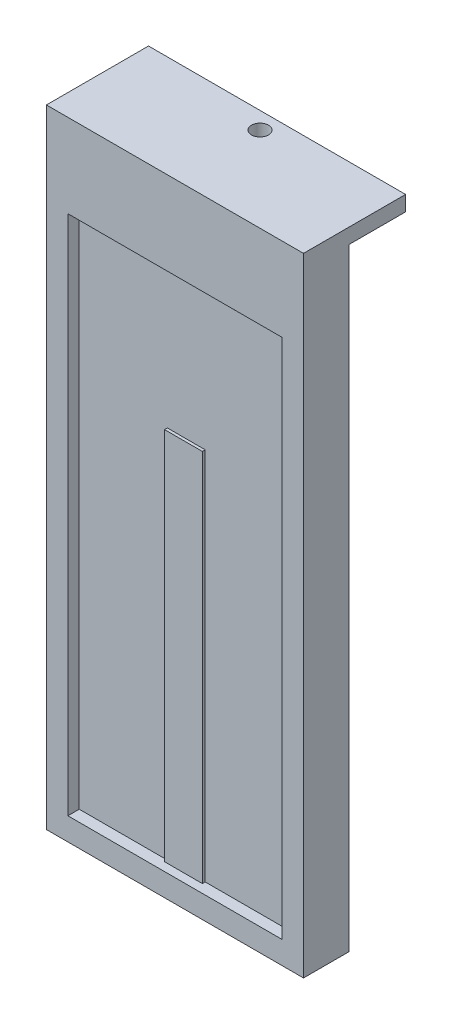
ISO-10303-21;
HEADER;
FILE_DESCRIPTION(('STEP AP214'),'2;1');
FILE_NAME('part.step','',(''),(''),'','','');
FILE_SCHEMA(('AUTOMOTIVE_DESIGN { 1 0 10303 214 1 1 1 1 }'));
ENDSEC;
DATA;
#1=APPLICATION_CONTEXT('core data for automotive mechanical design processes');
#2=APPLICATION_PROTOCOL_DEFINITION('international standard','automotive_design',2000,#1);
#3=PRODUCT_CONTEXT('',#1,'mechanical');
#4=PRODUCT('Part','Part','',(#3));
#5=PRODUCT_RELATED_PRODUCT_CATEGORY('part','',(#4));
#6=PRODUCT_DEFINITION_FORMATION('','',#4);
#7=PRODUCT_DEFINITION_CONTEXT('part definition',#1,'design');
#8=PRODUCT_DEFINITION('design','',#6,#7);
#9=PRODUCT_DEFINITION_SHAPE('','',#8);
#10=(LENGTH_UNIT() NAMED_UNIT(*) SI_UNIT(.MILLI.,.METRE.));
#11=(NAMED_UNIT(*) PLANE_ANGLE_UNIT() SI_UNIT($,.RADIAN.));
#12=(NAMED_UNIT(*) SI_UNIT($,.STERADIAN.) SOLID_ANGLE_UNIT());
#13=UNCERTAINTY_MEASURE_WITH_UNIT(LENGTH_MEASURE(1.E-05),#10,'distance_accuracy_value','');
#14=(GEOMETRIC_REPRESENTATION_CONTEXT(3) GLOBAL_UNCERTAINTY_ASSIGNED_CONTEXT((#13)) GLOBAL_UNIT_ASSIGNED_CONTEXT((#10,
#11,#12)) REPRESENTATION_CONTEXT('',''));
#15=CARTESIAN_POINT('',(0.,0.,0.));
#16=DIRECTION('',(0.,0.,1.));
#17=DIRECTION('',(1.,0.,0.));
#18=AXIS2_PLACEMENT_3D('',#15,#16,#17);
#19=CARTESIAN_POINT('',(-28.321,-75.,9.));
#20=DIRECTION('',(0.,-1.,0.));
#21=DIRECTION('',(0.,0.,-1.));
#22=AXIS2_PLACEMENT_3D('',#19,#20,#21);
#23=PLANE('',#22);
#24=DIRECTION('',(0.,0.,-1.));
#25=VECTOR('',#24,1.);
#26=CARTESIAN_POINT('',(5.,-75.,9.746));
#27=LINE('',#26,#25);
#28=CARTESIAN_POINT('',(5.,-75.,9.746));
#29=VERTEX_POINT('',#28);
#30=CARTESIAN_POINT('',(5.,-75.,9.));
#31=VERTEX_POINT('',#30);
#32=EDGE_CURVE('E65',#29,#31,#27,.T.);
#33=ORIENTED_EDGE('',*,*,#32,.F.);
#34=DIRECTION('',(1.,0.,0.));
#35=VECTOR('',#34,1.);
#36=CARTESIAN_POINT('',(-5.,-75.,9.746));
#37=LINE('',#36,#35);
#38=CARTESIAN_POINT('',(-5.,-75.,9.746));
#39=VERTEX_POINT('',#38);
#40=EDGE_CURVE('E60',#39,#29,#37,.T.);
#41=ORIENTED_EDGE('',*,*,#40,.F.);
#42=DIRECTION('',(0.,0.,-1.));
#43=VECTOR('',#42,1.);
#44=CARTESIAN_POINT('',(-5.,-75.,9.746));
#45=LINE('',#44,#43);
#46=CARTESIAN_POINT('',(-5.,-75.,9.));
#47=VERTEX_POINT('',#46);
#48=EDGE_CURVE('E176',#39,#47,#45,.T.);
#49=ORIENTED_EDGE('',*,*,#48,.T.);
#50=DIRECTION('',(1.,0.,0.));
#51=VECTOR('',#50,1.);
#52=CARTESIAN_POINT('',(-28.321,-75.,9.));
#53=LINE('',#52,#51);
#54=CARTESIAN_POINT('',(-28.321,-75.,9.));
#55=VERTEX_POINT('',#54);
#56=EDGE_CURVE('E194',#55,#47,#53,.T.);
#57=ORIENTED_EDGE('',*,*,#56,.F.);
#58=DIRECTION('',(0.,0.,1.));
#59=VECTOR('',#58,1.);
#60=CARTESIAN_POINT('',(-28.321,-75.,9.));
#61=LINE('',#60,#59);
#62=CARTESIAN_POINT('',(-28.321,-75.,12.));
#63=VERTEX_POINT('',#62);
#64=EDGE_CURVE('E212',#55,#63,#61,.T.);
#65=ORIENTED_EDGE('',*,*,#64,.T.);
#66=DIRECTION('',(1.,0.,0.));
#67=VECTOR('',#66,1.);
#68=CARTESIAN_POINT('',(-28.321,-75.,12.));
#69=LINE('',#68,#67);
#70=CARTESIAN_POINT('',(28.321,-75.,12.));
#71=VERTEX_POINT('',#70);
#72=EDGE_CURVE('E185',#63,#71,#69,.T.);
#73=ORIENTED_EDGE('',*,*,#72,.T.);
#74=DIRECTION('',(0.,0.,1.));
#75=VECTOR('',#74,1.);
#76=CARTESIAN_POINT('',(28.321,-75.,9.));
#77=LINE('',#76,#75);
#78=CARTESIAN_POINT('',(28.321,-75.,9.));
#79=VERTEX_POINT('',#78);
#80=EDGE_CURVE('E208',#79,#71,#77,.T.);
#81=ORIENTED_EDGE('',*,*,#80,.F.);
#82=EDGE_CURVE('E193',#31,#79,#53,.T.);
#83=ORIENTED_EDGE('',*,*,#82,.F.);
#84=EDGE_LOOP('',(#33,#41,#49,#57,#65,#73,#81,#83));
#85=FACE_BOUND('',#84,.T.);
#86=ADVANCED_FACE('F43',(#85),#23,.F.);
#87=CARTESIAN_POINT('',(0.,0.,9.));
#88=DIRECTION('',(0.,0.,-1.));
#89=DIRECTION('',(-1.,0.,0.));
#90=AXIS2_PLACEMENT_3D('',#87,#88,#89);
#91=PLANE('',#90);
#92=DIRECTION('',(0.,1.,0.));
#93=VECTOR('',#92,1.);
#94=CARTESIAN_POINT('',(5.,24.,9.));
#95=LINE('',#94,#93);
#96=CARTESIAN_POINT('',(5.,24.,9.));
#97=VERTEX_POINT('',#96);
#98=EDGE_CURVE('E168',#31,#97,#95,.T.);
#99=ORIENTED_EDGE('',*,*,#98,.F.);
#100=ORIENTED_EDGE('',*,*,#82,.T.);
#101=DIRECTION('',(0.,1.,0.));
#102=VECTOR('',#101,1.);
#103=CARTESIAN_POINT('',(28.321,-75.,9.));
#104=LINE('',#103,#102);
#105=CARTESIAN_POINT('',(28.321,62.922,9.));
#106=VERTEX_POINT('',#105);
#107=EDGE_CURVE('E180',#79,#106,#104,.T.);
#108=ORIENTED_EDGE('',*,*,#107,.T.);
#109=DIRECTION('',(-1.,0.,0.));
#110=VECTOR('',#109,1.);
#111=CARTESIAN_POINT('',(-28.321,62.922,9.));
#112=LINE('',#111,#110);
#113=CARTESIAN_POINT('',(-28.321,62.922,9.));
#114=VERTEX_POINT('',#113);
#115=EDGE_CURVE('E184',#106,#114,#112,.T.);
#116=ORIENTED_EDGE('',*,*,#115,.T.);
#117=DIRECTION('',(0.,-1.,0.));
#118=VECTOR('',#117,1.);
#119=CARTESIAN_POINT('',(-28.321,-75.,9.));
#120=LINE('',#119,#118);
#121=EDGE_CURVE('E189',#114,#55,#120,.T.);
#122=ORIENTED_EDGE('',*,*,#121,.T.);
#123=ORIENTED_EDGE('',*,*,#56,.T.);
#124=DIRECTION('',(0.,-1.,0.));
#125=VECTOR('',#124,1.);
#126=CARTESIAN_POINT('',(-5.,24.,9.));
#127=LINE('',#126,#125);
#128=CARTESIAN_POINT('',(-5.,24.,9.));
#129=VERTEX_POINT('',#128);
#130=EDGE_CURVE('E165',#129,#47,#127,.T.);
#131=ORIENTED_EDGE('',*,*,#130,.F.);
#132=DIRECTION('',(-1.,0.,0.));
#133=VECTOR('',#132,1.);
#134=CARTESIAN_POINT('',(-5.,24.,9.));
#135=LINE('',#134,#133);
#136=EDGE_CURVE('E516',#97,#129,#135,.T.);
#137=ORIENTED_EDGE('',*,*,#136,.F.);
#138=EDGE_LOOP('',(#99,#100,#108,#116,#122,#123,#131,#137));
#139=FACE_BOUND('',#138,.T.);
#140=ADVANCED_FACE('F321',(#139),#91,.F.);
#141=CARTESIAN_POINT('',(34.,-81.,12.));
#142=DIRECTION('',(-1.,0.,0.));
#143=DIRECTION('',(0.,0.,1.));
#144=AXIS2_PLACEMENT_3D('',#141,#142,#143);
#145=PLANE('',#144);
#146=DIRECTION('',(0.,1.,0.));
#147=VECTOR('',#146,1.);
#148=CARTESIAN_POINT('',(34.,-81.,0.));
#149=LINE('',#148,#147);
#150=CARTESIAN_POINT('',(34.,-81.,0.));
#151=VERTEX_POINT('',#150);
#152=CARTESIAN_POINT('',(34.,81.,0.));
#153=VERTEX_POINT('',#152);
#154=EDGE_CURVE('E256',#151,#153,#149,.T.);
#155=ORIENTED_EDGE('',*,*,#154,.T.);
#156=DIRECTION('',(0.,0.,-1.));
#157=VECTOR('',#156,1.);
#158=CARTESIAN_POINT('',(34.,81.,12.));
#159=LINE('',#158,#157);
#160=CARTESIAN_POINT('',(34.,81.,-15.));
#161=VERTEX_POINT('',#160);
#162=EDGE_CURVE('E244',#153,#161,#159,.T.);
#163=ORIENTED_EDGE('',*,*,#162,.T.);
#164=DIRECTION('',(0.,-1.,0.));
#165=VECTOR('',#164,1.);
#166=CARTESIAN_POINT('',(34.,85.,-15.));
#167=LINE('',#166,#165);
#168=CARTESIAN_POINT('',(34.,85.,-15.));
#169=VERTEX_POINT('',#168);
#170=EDGE_CURVE('E252',#169,#161,#167,.T.);
#171=ORIENTED_EDGE('',*,*,#170,.F.);
#172=DIRECTION('',(0.,0.,-1.));
#173=VECTOR('',#172,1.);
#174=CARTESIAN_POINT('',(34.,85.,12.));
#175=LINE('',#174,#173);
#176=CARTESIAN_POINT('',(34.,85.,12.));
#177=VERTEX_POINT('',#176);
#178=EDGE_CURVE('E233',#177,#169,#175,.T.);
#179=ORIENTED_EDGE('',*,*,#178,.F.);
#180=DIRECTION('',(0.,1.,0.));
#181=VECTOR('',#180,1.);
#182=CARTESIAN_POINT('',(34.,-81.,12.));
#183=LINE('',#182,#181);
#184=CARTESIAN_POINT('',(34.,-81.,12.));
#185=VERTEX_POINT('',#184);
#186=EDGE_CURVE('E257',#185,#177,#183,.T.);
#187=ORIENTED_EDGE('',*,*,#186,.F.);
#188=DIRECTION('',(0.,0.,-1.));
#189=VECTOR('',#188,1.);
#190=CARTESIAN_POINT('',(34.,-81.,12.));
#191=LINE('',#190,#189);
#192=EDGE_CURVE('E53',#185,#151,#191,.T.);
#193=ORIENTED_EDGE('',*,*,#192,.T.);
#194=EDGE_LOOP('',(#155,#163,#171,#179,#187,#193));
#195=FACE_BOUND('',#194,.T.);
#196=ADVANCED_FACE('F45',(#195),#145,.F.);
#197=CARTESIAN_POINT('',(-34.,-81.,12.));
#198=DIRECTION('',(1.,0.,0.));
#199=DIRECTION('',(0.,0.,-1.));
#200=AXIS2_PLACEMENT_3D('',#197,#198,#199);
#201=PLANE('',#200);
#202=DIRECTION('',(0.,-1.,0.));
#203=VECTOR('',#202,1.);
#204=CARTESIAN_POINT('',(-34.,-81.,0.));
#205=LINE('',#204,#203);
#206=CARTESIAN_POINT('',(-34.,81.,0.));
#207=VERTEX_POINT('',#206);
#208=CARTESIAN_POINT('',(-34.,-81.,0.));
#209=VERTEX_POINT('',#208);
#210=EDGE_CURVE('E274',#207,#209,#205,.T.);
#211=ORIENTED_EDGE('',*,*,#210,.T.);
#212=DIRECTION('',(0.,0.,-1.));
#213=VECTOR('',#212,1.);
#214=CARTESIAN_POINT('',(-34.,-81.,12.));
#215=LINE('',#214,#213);
#216=CARTESIAN_POINT('',(-34.,-81.,12.));
#217=VERTEX_POINT('',#216);
#218=EDGE_CURVE('E11',#217,#209,#215,.T.);
#219=ORIENTED_EDGE('',*,*,#218,.F.);
#220=DIRECTION('',(0.,-1.,0.));
#221=VECTOR('',#220,1.);
#222=CARTESIAN_POINT('',(-34.,-81.,12.));
#223=LINE('',#222,#221);
#224=CARTESIAN_POINT('',(-34.,85.,12.));
#225=VERTEX_POINT('',#224);
#226=EDGE_CURVE('E260',#225,#217,#223,.T.);
#227=ORIENTED_EDGE('',*,*,#226,.F.);
#228=DIRECTION('',(0.,0.,1.));
#229=VECTOR('',#228,1.);
#230=CARTESIAN_POINT('',(-34.,85.,12.));
#231=LINE('',#230,#229);
#232=CARTESIAN_POINT('',(-34.,85.,-15.));
#233=VERTEX_POINT('',#232);
#234=EDGE_CURVE('E224',#233,#225,#231,.T.);
#235=ORIENTED_EDGE('',*,*,#234,.F.);
#236=DIRECTION('',(0.,-1.,0.));
#237=VECTOR('',#236,1.);
#238=CARTESIAN_POINT('',(-34.,85.,-15.));
#239=LINE('',#238,#237);
#240=CARTESIAN_POINT('',(-34.,81.,-15.));
#241=VERTEX_POINT('',#240);
#242=EDGE_CURVE('E239',#233,#241,#239,.T.);
#243=ORIENTED_EDGE('',*,*,#242,.T.);
#244=DIRECTION('',(0.,0.,1.));
#245=VECTOR('',#244,1.);
#246=CARTESIAN_POINT('',(-34.,81.,12.));
#247=LINE('',#246,#245);
#248=EDGE_CURVE('E240',#241,#207,#247,.T.);
#249=ORIENTED_EDGE('',*,*,#248,.T.);
#250=EDGE_LOOP('',(#211,#219,#227,#235,#243,#249));
#251=FACE_BOUND('',#250,.T.);
#252=ADVANCED_FACE('F297',(#251),#201,.F.);
#253=CARTESIAN_POINT('',(-34.,-81.,12.));
#254=DIRECTION('',(0.,1.,0.));
#255=DIRECTION('',(0.,0.,1.));
#256=AXIS2_PLACEMENT_3D('',#253,#254,#255);
#257=PLANE('',#256);
#258=DIRECTION('',(1.,0.,0.));
#259=VECTOR('',#258,1.);
#260=CARTESIAN_POINT('',(-34.,-81.,0.));
#261=LINE('',#260,#259);
#262=EDGE_CURVE('E261',#209,#151,#261,.T.);
#263=ORIENTED_EDGE('',*,*,#262,.T.);
#264=ORIENTED_EDGE('',*,*,#192,.F.);
#265=DIRECTION('',(1.,0.,0.));
#266=VECTOR('',#265,1.);
#267=CARTESIAN_POINT('',(-34.,-81.,12.));
#268=LINE('',#267,#266);
#269=EDGE_CURVE('E264',#217,#185,#268,.T.);
#270=ORIENTED_EDGE('',*,*,#269,.F.);
#271=ORIENTED_EDGE('',*,*,#218,.T.);
#272=EDGE_LOOP('',(#263,#264,#270,#271));
#273=FACE_BOUND('',#272,.T.);
#274=ADVANCED_FACE('F310',(#273),#257,.F.);
#275=CARTESIAN_POINT('',(0.,0.,12.));
#276=DIRECTION('',(0.,0.,-1.));
#277=DIRECTION('',(-1.,0.,0.));
#278=AXIS2_PLACEMENT_3D('',#275,#276,#277);
#279=PLANE('',#278);
#280=DIRECTION('',(-1.,0.,0.));
#281=VECTOR('',#280,1.);
#282=CARTESIAN_POINT('',(-28.321,62.922,12.));
#283=LINE('',#282,#281);
#284=CARTESIAN_POINT('',(28.321,62.922,12.));
#285=VERTEX_POINT('',#284);
#286=CARTESIAN_POINT('',(-28.321,62.922,12.));
#287=VERTEX_POINT('',#286);
#288=EDGE_CURVE('E174',#285,#287,#283,.T.);
#289=ORIENTED_EDGE('',*,*,#288,.F.);
#290=DIRECTION('',(0.,1.,0.));
#291=VECTOR('',#290,1.);
#292=CARTESIAN_POINT('',(28.321,-75.,12.));
#293=LINE('',#292,#291);
#294=EDGE_CURVE('E170',#71,#285,#293,.T.);
#295=ORIENTED_EDGE('',*,*,#294,.F.);
#296=ORIENTED_EDGE('',*,*,#72,.F.);
#297=DIRECTION('',(0.,-1.,0.));
#298=VECTOR('',#297,1.);
#299=CARTESIAN_POINT('',(-28.321,-75.,12.));
#300=LINE('',#299,#298);
#301=EDGE_CURVE('E201',#287,#63,#300,.T.);
#302=ORIENTED_EDGE('',*,*,#301,.F.);
#303=EDGE_LOOP('',(#289,#295,#296,#302));
#304=FACE_BOUND('',#303,.T.);
#305=ORIENTED_EDGE('',*,*,#186,.T.);
#306=DIRECTION('',(1.,0.,0.));
#307=VECTOR('',#306,1.);
#308=CARTESIAN_POINT('',(-34.,85.,12.));
#309=LINE('',#308,#307);
#310=EDGE_CURVE('E228',#225,#177,#309,.T.);
#311=ORIENTED_EDGE('',*,*,#310,.F.);
#312=ORIENTED_EDGE('',*,*,#226,.T.);
#313=ORIENTED_EDGE('',*,*,#269,.T.);
#314=EDGE_LOOP('',(#305,#311,#312,#313));
#315=FACE_BOUND('',#314,.T.);
#316=ADVANCED_FACE('F309',(#304,#315),#279,.F.);
#317=CARTESIAN_POINT('',(0.,0.,0.));
#318=DIRECTION('',(0.,0.,-1.));
#319=DIRECTION('',(-1.,0.,0.));
#320=AXIS2_PLACEMENT_3D('',#317,#318,#319);
#321=PLANE('',#320);
#322=ORIENTED_EDGE('',*,*,#154,.F.);
#323=ORIENTED_EDGE('',*,*,#262,.F.);
#324=ORIENTED_EDGE('',*,*,#210,.F.);
#325=DIRECTION('',(-1.,0.,0.));
#326=VECTOR('',#325,1.);
#327=CARTESIAN_POINT('',(-34.,81.,0.));
#328=LINE('',#327,#326);
#329=EDGE_CURVE('E270',#153,#207,#328,.T.);
#330=ORIENTED_EDGE('',*,*,#329,.F.);
#331=EDGE_LOOP('',(#322,#323,#324,#330));
#332=FACE_BOUND('',#331,.T.);
#333=ADVANCED_FACE('F291',(#332),#321,.T.);
#334=CARTESIAN_POINT('',(-34.,85.,-15.));
#335=DIRECTION('',(0.,0.,1.));
#336=DIRECTION('',(1.,0.,0.));
#337=AXIS2_PLACEMENT_3D('',#334,#335,#336);
#338=PLANE('',#337);
#339=DIRECTION('',(-1.,0.,0.));
#340=VECTOR('',#339,1.);
#341=CARTESIAN_POINT('',(-34.,81.,-15.));
#342=LINE('',#341,#340);
#343=EDGE_CURVE('E229',#161,#241,#342,.T.);
#344=ORIENTED_EDGE('',*,*,#343,.T.);
#345=ORIENTED_EDGE('',*,*,#242,.F.);
#346=DIRECTION('',(-1.,0.,0.));
#347=VECTOR('',#346,1.);
#348=CARTESIAN_POINT('',(-34.,85.,-15.));
#349=LINE('',#348,#347);
#350=EDGE_CURVE('E236',#169,#233,#349,.T.);
#351=ORIENTED_EDGE('',*,*,#350,.F.);
#352=ORIENTED_EDGE('',*,*,#170,.T.);
#353=EDGE_LOOP('',(#344,#345,#351,#352));
#354=FACE_BOUND('',#353,.T.);
#355=ADVANCED_FACE('F303',(#354),#338,.F.);
#356=CARTESIAN_POINT('',(0.,85.,0.));
#357=DIRECTION('',(0.,-1.,0.));
#358=DIRECTION('',(0.,0.,-1.));
#359=AXIS2_PLACEMENT_3D('',#356,#357,#358);
#360=PLANE('',#359);
#361=CARTESIAN_POINT('',(0.,85.,-10.5));
#362=DIRECTION('',(0.,1.,0.));
#363=DIRECTION('',(0.,0.,1.));
#364=AXIS2_PLACEMENT_3D('',#361,#362,#363);
#365=CIRCLE('',#364,2.25);
#366=CARTESIAN_POINT('',(0.,85.,-8.25000000000001));
#367=VERTEX_POINT('',#366);
#368=EDGE_CURVE('E211',#367,#367,#365,.T.);
#369=ORIENTED_EDGE('',*,*,#368,.F.);
#370=EDGE_LOOP('',(#369));
#371=FACE_BOUND('',#370,.T.);
#372=ORIENTED_EDGE('',*,*,#234,.T.);
#373=ORIENTED_EDGE('',*,*,#310,.T.);
#374=ORIENTED_EDGE('',*,*,#178,.T.);
#375=ORIENTED_EDGE('',*,*,#350,.T.);
#376=EDGE_LOOP('',(#372,#373,#374,#375));
#377=FACE_BOUND('',#376,.T.);
#378=ADVANCED_FACE('F306',(#371,#377),#360,.F.);
#379=CARTESIAN_POINT('',(0.,81.,0.));
#380=DIRECTION('',(0.,-1.,0.));
#381=DIRECTION('',(0.,0.,-1.));
#382=AXIS2_PLACEMENT_3D('',#379,#380,#381);
#383=PLANE('',#382);
#384=CARTESIAN_POINT('',(0.,81.,-10.5));
#385=DIRECTION('',(0.,-1.,0.));
#386=DIRECTION('',(0.,0.,-1.));
#387=AXIS2_PLACEMENT_3D('',#384,#385,#386);
#388=CIRCLE('',#387,2.25);
#389=CARTESIAN_POINT('',(0.,81.,-12.75));
#390=VERTEX_POINT('',#389);
#391=EDGE_CURVE('E47',#390,#390,#388,.T.);
#392=ORIENTED_EDGE('',*,*,#391,.F.);
#393=EDGE_LOOP('',(#392));
#394=FACE_BOUND('',#393,.T.);
#395=ORIENTED_EDGE('',*,*,#162,.F.);
#396=ORIENTED_EDGE('',*,*,#329,.T.);
#397=ORIENTED_EDGE('',*,*,#248,.F.);
#398=ORIENTED_EDGE('',*,*,#343,.F.);
#399=EDGE_LOOP('',(#395,#396,#397,#398));
#400=FACE_BOUND('',#399,.T.);
#401=ADVANCED_FACE('F294',(#394,#400),#383,.T.);
#402=CARTESIAN_POINT('',(0.,-81.,-10.5));
#403=DIRECTION('',(0.,1.,0.));
#404=DIRECTION('',(0.,0.,1.));
#405=AXIS2_PLACEMENT_3D('',#402,#403,#404);
#406=CYLINDRICAL_SURFACE('',#405,2.25);
#407=ORIENTED_EDGE('',*,*,#391,.T.);
#408=EDGE_LOOP('',(#407));
#409=FACE_BOUND('',#408,.T.);
#410=ORIENTED_EDGE('',*,*,#368,.T.);
#411=EDGE_LOOP('',(#410));
#412=FACE_BOUND('',#411,.T.);
#413=ADVANCED_FACE('F341',(#409,#412),#406,.F.);
#414=CARTESIAN_POINT('',(28.321,-75.,9.));
#415=DIRECTION('',(1.,0.,0.));
#416=DIRECTION('',(0.,0.,-1.));
#417=AXIS2_PLACEMENT_3D('',#414,#415,#416);
#418=PLANE('',#417);
#419=ORIENTED_EDGE('',*,*,#294,.T.);
#420=DIRECTION('',(0.,0.,1.));
#421=VECTOR('',#420,1.);
#422=CARTESIAN_POINT('',(28.321,62.922,9.));
#423=LINE('',#422,#421);
#424=EDGE_CURVE('E196',#106,#285,#423,.T.);
#425=ORIENTED_EDGE('',*,*,#424,.F.);
#426=ORIENTED_EDGE('',*,*,#107,.F.);
#427=ORIENTED_EDGE('',*,*,#80,.T.);
#428=EDGE_LOOP('',(#419,#425,#426,#427));
#429=FACE_BOUND('',#428,.T.);
#430=ADVANCED_FACE('F334',(#429),#418,.F.);
#431=CARTESIAN_POINT('',(-28.321,-75.,9.));
#432=DIRECTION('',(-1.,0.,0.));
#433=DIRECTION('',(0.,0.,1.));
#434=AXIS2_PLACEMENT_3D('',#431,#432,#433);
#435=PLANE('',#434);
#436=ORIENTED_EDGE('',*,*,#301,.T.);
#437=ORIENTED_EDGE('',*,*,#64,.F.);
#438=ORIENTED_EDGE('',*,*,#121,.F.);
#439=DIRECTION('',(0.,0.,1.));
#440=VECTOR('',#439,1.);
#441=CARTESIAN_POINT('',(-28.321,62.922,9.));
#442=LINE('',#441,#440);
#443=EDGE_CURVE('E215',#114,#287,#442,.T.);
#444=ORIENTED_EDGE('',*,*,#443,.T.);
#445=EDGE_LOOP('',(#436,#437,#438,#444));
#446=FACE_BOUND('',#445,.T.);
#447=ADVANCED_FACE('F330',(#446),#435,.F.);
#448=CARTESIAN_POINT('',(-28.321,62.922,9.));
#449=DIRECTION('',(0.,1.,0.));
#450=DIRECTION('',(0.,0.,1.));
#451=AXIS2_PLACEMENT_3D('',#448,#449,#450);
#452=PLANE('',#451);
#453=ORIENTED_EDGE('',*,*,#288,.T.);
#454=ORIENTED_EDGE('',*,*,#443,.F.);
#455=ORIENTED_EDGE('',*,*,#115,.F.);
#456=ORIENTED_EDGE('',*,*,#424,.T.);
#457=EDGE_LOOP('',(#453,#454,#455,#456));
#458=FACE_BOUND('',#457,.T.);
#459=ADVANCED_FACE('F333',(#458),#452,.F.);
#460=CARTESIAN_POINT('',(5.,24.,9.746));
#461=DIRECTION('',(-1.,0.,0.));
#462=DIRECTION('',(0.,-1.,0.));
#463=AXIS2_PLACEMENT_3D('',#460,#461,#462);
#464=PLANE('',#463);
#465=ORIENTED_EDGE('',*,*,#98,.T.);
#466=DIRECTION('',(0.,0.,-1.));
#467=VECTOR('',#466,1.);
#468=CARTESIAN_POINT('',(5.,24.,9.746));
#469=LINE('',#468,#467);
#470=CARTESIAN_POINT('',(5.,24.,9.746));
#471=VERTEX_POINT('',#470);
#472=EDGE_CURVE('E151',#471,#97,#469,.T.);
#473=ORIENTED_EDGE('',*,*,#472,.F.);
#474=DIRECTION('',(0.,1.,0.));
#475=VECTOR('',#474,1.);
#476=CARTESIAN_POINT('',(5.,24.,9.746));
#477=LINE('',#476,#475);
#478=EDGE_CURVE('E159',#29,#471,#477,.T.);
#479=ORIENTED_EDGE('',*,*,#478,.F.);
#480=ORIENTED_EDGE('',*,*,#32,.T.);
#481=EDGE_LOOP('',(#465,#473,#479,#480));
#482=FACE_BOUND('',#481,.T.);
#483=ADVANCED_FACE('F167',(#482),#464,.F.);
#484=CARTESIAN_POINT('',(-5.,24.,9.746));
#485=DIRECTION('',(0.,-1.,0.));
#486=DIRECTION('',(0.,0.,-1.));
#487=AXIS2_PLACEMENT_3D('',#484,#485,#486);
#488=PLANE('',#487);
#489=ORIENTED_EDGE('',*,*,#136,.T.);
#490=DIRECTION('',(0.,0.,-1.));
#491=VECTOR('',#490,1.);
#492=CARTESIAN_POINT('',(-5.,24.,9.746));
#493=LINE('',#492,#491);
#494=CARTESIAN_POINT('',(-5.,24.,9.746));
#495=VERTEX_POINT('',#494);
#496=EDGE_CURVE('E154',#495,#129,#493,.T.);
#497=ORIENTED_EDGE('',*,*,#496,.F.);
#498=DIRECTION('',(-1.,0.,0.));
#499=VECTOR('',#498,1.);
#500=CARTESIAN_POINT('',(-5.,24.,9.746));
#501=LINE('',#500,#499);
#502=EDGE_CURVE('E146',#471,#495,#501,.T.);
#503=ORIENTED_EDGE('',*,*,#502,.F.);
#504=ORIENTED_EDGE('',*,*,#472,.T.);
#505=EDGE_LOOP('',(#489,#497,#503,#504));
#506=FACE_BOUND('',#505,.T.);
#507=ADVANCED_FACE('F149',(#506),#488,.F.);
#508=CARTESIAN_POINT('',(-5.,24.,9.746));
#509=DIRECTION('',(1.,0.,0.));
#510=DIRECTION('',(0.,1.,0.));
#511=AXIS2_PLACEMENT_3D('',#508,#509,#510);
#512=PLANE('',#511);
#513=ORIENTED_EDGE('',*,*,#130,.T.);
#514=ORIENTED_EDGE('',*,*,#48,.F.);
#515=DIRECTION('',(0.,-1.,0.));
#516=VECTOR('',#515,1.);
#517=CARTESIAN_POINT('',(-5.,24.,9.746));
#518=LINE('',#517,#516);
#519=EDGE_CURVE('E158',#495,#39,#518,.T.);
#520=ORIENTED_EDGE('',*,*,#519,.F.);
#521=ORIENTED_EDGE('',*,*,#496,.T.);
#522=EDGE_LOOP('',(#513,#514,#520,#521));
#523=FACE_BOUND('',#522,.T.);
#524=ADVANCED_FACE('F399',(#523),#512,.F.);
#525=CARTESIAN_POINT('',(0.,0.,9.746));
#526=DIRECTION('',(0.,0.,1.));
#527=DIRECTION('',(1.,0.,0.));
#528=AXIS2_PLACEMENT_3D('',#525,#526,#527);
#529=PLANE('',#528);
#530=ORIENTED_EDGE('',*,*,#478,.T.);
#531=ORIENTED_EDGE('',*,*,#502,.T.);
#532=ORIENTED_EDGE('',*,*,#519,.T.);
#533=ORIENTED_EDGE('',*,*,#40,.T.);
#534=EDGE_LOOP('',(#530,#531,#532,#533));
#535=FACE_BOUND('',#534,.T.);
#536=ADVANCED_FACE('F162',(#535),#529,.T.);
#537=CLOSED_SHELL('',(#86,#140,#196,#252,#274,#316,#333,#355,#378,#401,#413,#430,#447,#459,#483,
#507,#524,#536));
#538=MANIFOLD_SOLID_BREP('B2',#537);
#539=ADVANCED_BREP_SHAPE_REPRESENTATION('',(#18,#538),#14);
#540=SHAPE_DEFINITION_REPRESENTATION(#9,#539);
ENDSEC;
END-ISO-10303-21;
